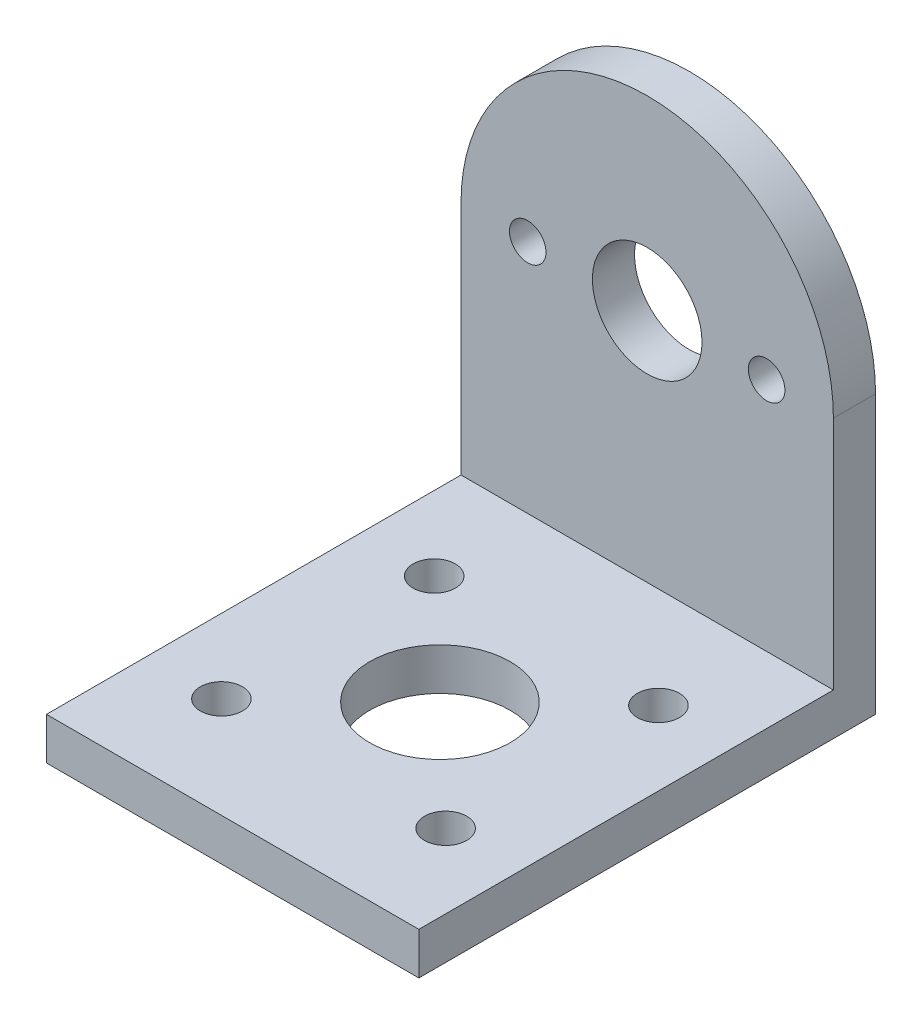
ISO-10303-21;
HEADER;
FILE_DESCRIPTION(('STEP AP214'),'2;1');
FILE_NAME('part.step','',(''),(''),'','','');
FILE_SCHEMA(('AUTOMOTIVE_DESIGN { 1 0 10303 214 1 1 1 1 }'));
ENDSEC;
DATA;
#1=APPLICATION_CONTEXT('core data for automotive mechanical design processes');
#2=APPLICATION_PROTOCOL_DEFINITION('international standard','automotive_design',2000,#1);
#3=PRODUCT_CONTEXT('',#1,'mechanical');
#4=PRODUCT('Part','Part','',(#3));
#5=PRODUCT_RELATED_PRODUCT_CATEGORY('part','',(#4));
#6=PRODUCT_DEFINITION_FORMATION('','',#4);
#7=PRODUCT_DEFINITION_CONTEXT('part definition',#1,'design');
#8=PRODUCT_DEFINITION('design','',#6,#7);
#9=PRODUCT_DEFINITION_SHAPE('','',#8);
#10=(LENGTH_UNIT() NAMED_UNIT(*) SI_UNIT(.MILLI.,.METRE.));
#11=(NAMED_UNIT(*) PLANE_ANGLE_UNIT() SI_UNIT($,.RADIAN.));
#12=(NAMED_UNIT(*) SI_UNIT($,.STERADIAN.) SOLID_ANGLE_UNIT());
#13=UNCERTAINTY_MEASURE_WITH_UNIT(LENGTH_MEASURE(1.E-05),#10,'distance_accuracy_value','');
#14=(GEOMETRIC_REPRESENTATION_CONTEXT(3) GLOBAL_UNCERTAINTY_ASSIGNED_CONTEXT((#13)) GLOBAL_UNIT_ASSIGNED_CONTEXT((#10,
#11,#12)) REPRESENTATION_CONTEXT('',''));
#15=CARTESIAN_POINT('',(0.,0.,0.));
#16=DIRECTION('',(0.,0.,1.));
#17=DIRECTION('',(1.,0.,0.));
#18=AXIS2_PLACEMENT_3D('',#15,#16,#17);
#19=CARTESIAN_POINT('',(0.,3.25,3.));
#20=DIRECTION('',(0.,0.,-1.));
#21=DIRECTION('',(-1.,0.,0.));
#22=AXIS2_PLACEMENT_3D('',#19,#20,#21);
#23=CYLINDRICAL_SURFACE('',#22,13.25);
#24=CARTESIAN_POINT('',(0.,3.25,0.));
#25=DIRECTION('',(0.,0.,1.));
#26=DIRECTION('',(1.,0.,0.));
#27=AXIS2_PLACEMENT_3D('',#24,#25,#26);
#28=CIRCLE('',#27,13.25);
#29=CARTESIAN_POINT('',(13.25,3.25,0.));
#30=VERTEX_POINT('',#29);
#31=CARTESIAN_POINT('',(-13.25,3.25,0.));
#32=VERTEX_POINT('',#31);
#33=EDGE_CURVE('E95',#30,#32,#28,.T.);
#34=ORIENTED_EDGE('',*,*,#33,.T.);
#35=DIRECTION('',(0.,0.,-1.));
#36=VECTOR('',#35,1.);
#37=CARTESIAN_POINT('',(-13.25,3.25,3.));
#38=LINE('',#37,#36);
#39=CARTESIAN_POINT('',(-13.25,3.25,3.));
#40=VERTEX_POINT('',#39);
#41=EDGE_CURVE('E11',#40,#32,#38,.T.);
#42=ORIENTED_EDGE('',*,*,#41,.F.);
#43=CARTESIAN_POINT('',(0.,3.25,3.));
#44=DIRECTION('',(0.,0.,1.));
#45=DIRECTION('',(1.,0.,0.));
#46=AXIS2_PLACEMENT_3D('',#43,#44,#45);
#47=CIRCLE('',#46,13.25);
#48=CARTESIAN_POINT('',(13.25,3.25,3.));
#49=VERTEX_POINT('',#48);
#50=EDGE_CURVE('E97',#49,#40,#47,.T.);
#51=ORIENTED_EDGE('',*,*,#50,.F.);
#52=DIRECTION('',(0.,0.,-1.));
#53=VECTOR('',#52,1.);
#54=CARTESIAN_POINT('',(13.25,3.25,3.));
#55=LINE('',#54,#53);
#56=EDGE_CURVE('E81',#49,#30,#55,.T.);
#57=ORIENTED_EDGE('',*,*,#56,.T.);
#58=EDGE_LOOP('',(#34,#42,#51,#57));
#59=FACE_BOUND('',#58,.T.);
#60=ADVANCED_FACE('F39',(#59),#23,.T.);
#61=CARTESIAN_POINT('',(-13.25,0.,3.));
#62=DIRECTION('',(-1.,0.,0.));
#63=DIRECTION('',(0.,0.,1.));
#64=AXIS2_PLACEMENT_3D('',#61,#62,#63);
#65=PLANE('',#64);
#66=DIRECTION('',(0.,1.,0.));
#67=VECTOR('',#66,1.);
#68=CARTESIAN_POINT('',(-13.25,0.,0.));
#69=LINE('',#68,#67);
#70=CARTESIAN_POINT('',(-13.25,-16.5,0.));
#71=VERTEX_POINT('',#70);
#72=EDGE_CURVE('E101',#71,#32,#69,.T.);
#73=ORIENTED_EDGE('',*,*,#72,.F.);
#74=DIRECTION('',(0.,0.,-1.));
#75=VECTOR('',#74,1.);
#76=CARTESIAN_POINT('',(-13.25,-16.5,3.));
#77=LINE('',#76,#75);
#78=CARTESIAN_POINT('',(-13.25,-16.5,32.4999999999989));
#79=VERTEX_POINT('',#78);
#80=EDGE_CURVE('E47',#79,#71,#77,.T.);
#81=ORIENTED_EDGE('',*,*,#80,.F.);
#82=DIRECTION('',(0.,-1.,0.));
#83=VECTOR('',#82,1.);
#84=CARTESIAN_POINT('',(-13.25,-13.5,32.4999999999989));
#85=LINE('',#84,#83);
#86=CARTESIAN_POINT('',(-13.25,-13.5,32.4999999999989));
#87=VERTEX_POINT('',#86);
#88=EDGE_CURVE('E140',#87,#79,#85,.T.);
#89=ORIENTED_EDGE('',*,*,#88,.F.);
#90=DIRECTION('',(0.,0.,1.));
#91=VECTOR('',#90,1.);
#92=CARTESIAN_POINT('',(-13.25,-13.5,0.));
#93=LINE('',#92,#91);
#94=CARTESIAN_POINT('',(-13.25,-13.5,3.));
#95=VERTEX_POINT('',#94);
#96=EDGE_CURVE('E126',#95,#87,#93,.T.);
#97=ORIENTED_EDGE('',*,*,#96,.F.);
#98=DIRECTION('',(0.,1.,0.));
#99=VECTOR('',#98,1.);
#100=CARTESIAN_POINT('',(-13.25,0.,3.));
#101=LINE('',#100,#99);
#102=EDGE_CURVE('E124',#95,#40,#101,.T.);
#103=ORIENTED_EDGE('',*,*,#102,.T.);
#104=ORIENTED_EDGE('',*,*,#41,.T.);
#105=EDGE_LOOP('',(#73,#81,#89,#97,#103,#104));
#106=FACE_BOUND('',#105,.T.);
#107=ADVANCED_FACE('F122',(#106),#65,.T.);
#108=CARTESIAN_POINT('',(0.,-16.5,3.));
#109=DIRECTION('',(0.,1.,0.));
#110=DIRECTION('',(0.,0.,1.));
#111=AXIS2_PLACEMENT_3D('',#108,#109,#110);
#112=PLANE('',#111);
#113=DIRECTION('',(1.,0.,0.));
#114=VECTOR('',#113,1.);
#115=CARTESIAN_POINT('',(0.,-16.5,0.));
#116=LINE('',#115,#114);
#117=CARTESIAN_POINT('',(13.25,-16.5,0.));
#118=VERTEX_POINT('',#117);
#119=EDGE_CURVE('E90',#71,#118,#116,.T.);
#120=ORIENTED_EDGE('',*,*,#119,.T.);
#121=DIRECTION('',(0.,0.,-1.));
#122=VECTOR('',#121,1.);
#123=CARTESIAN_POINT('',(13.25,-16.5,3.));
#124=LINE('',#123,#122);
#125=CARTESIAN_POINT('',(13.25,-16.5,32.4999999999989));
#126=VERTEX_POINT('',#125);
#127=EDGE_CURVE('E85',#126,#118,#124,.T.);
#128=ORIENTED_EDGE('',*,*,#127,.F.);
#129=DIRECTION('',(1.,0.,0.));
#130=VECTOR('',#129,1.);
#131=CARTESIAN_POINT('',(0.,-16.5,32.4999999999989));
#132=LINE('',#131,#130);
#133=EDGE_CURVE('E118',#79,#126,#132,.T.);
#134=ORIENTED_EDGE('',*,*,#133,.F.);
#135=ORIENTED_EDGE('',*,*,#80,.T.);
#136=EDGE_LOOP('',(#120,#128,#134,#135));
#137=FACE_BOUND('',#136,.T.);
#138=CARTESIAN_POINT('',(7.97733578583133,-16.5,10.1786446073314));
#139=DIRECTION('',(0.,-1.,0.));
#140=DIRECTION('',(0.,0.,-1.));
#141=AXIS2_PLACEMENT_3D('',#138,#139,#140);
#142=CIRCLE('',#141,1.5);
#143=CARTESIAN_POINT('',(7.97733578583133,-16.5,8.67864460733137));
#144=VERTEX_POINT('',#143);
#145=EDGE_CURVE('E233',#144,#144,#142,.T.);
#146=ORIENTED_EDGE('',*,*,#145,.F.);
#147=EDGE_LOOP('',(#146));
#148=FACE_BOUND('',#147,.T.);
#149=CARTESIAN_POINT('',(7.97733578583133,-16.5,25.3213553926675));
#150=DIRECTION('',(0.,-1.,0.));
#151=DIRECTION('',(0.,0.,-1.));
#152=AXIS2_PLACEMENT_3D('',#149,#150,#151);
#153=CIRCLE('',#152,1.5);
#154=CARTESIAN_POINT('',(7.97733578583133,-16.5,23.8213553926675));
#155=VERTEX_POINT('',#154);
#156=EDGE_CURVE('E236',#155,#155,#153,.T.);
#157=ORIENTED_EDGE('',*,*,#156,.F.);
#158=EDGE_LOOP('',(#157));
#159=FACE_BOUND('',#158,.T.);
#160=CARTESIAN_POINT('',(0.,-16.5,17.7499999999994));
#161=DIRECTION('',(0.,-1.,0.));
#162=DIRECTION('',(0.,0.,-1.));
#163=AXIS2_PLACEMENT_3D('',#160,#161,#162);
#164=CIRCLE('',#163,5.);
#165=CARTESIAN_POINT('',(0.,-16.5,12.7499999999994));
#166=VERTEX_POINT('',#165);
#167=EDGE_CURVE('E239',#166,#166,#164,.T.);
#168=ORIENTED_EDGE('',*,*,#167,.F.);
#169=EDGE_LOOP('',(#168));
#170=FACE_BOUND('',#169,.T.);
#171=CARTESIAN_POINT('',(-7.97733578583133,-16.5,25.3213553926675));
#172=DIRECTION('',(0.,-1.,0.));
#173=DIRECTION('',(0.,0.,-1.));
#174=AXIS2_PLACEMENT_3D('',#171,#172,#173);
#175=CIRCLE('',#174,1.5);
#176=CARTESIAN_POINT('',(-7.97733578583133,-16.5,23.8213553926675));
#177=VERTEX_POINT('',#176);
#178=EDGE_CURVE('E242',#177,#177,#175,.T.);
#179=ORIENTED_EDGE('',*,*,#178,.F.);
#180=EDGE_LOOP('',(#179));
#181=FACE_BOUND('',#180,.T.);
#182=CARTESIAN_POINT('',(-7.97733578583133,-16.5,10.1786446073314));
#183=DIRECTION('',(0.,-1.,0.));
#184=DIRECTION('',(0.,0.,-1.));
#185=AXIS2_PLACEMENT_3D('',#182,#183,#184);
#186=CIRCLE('',#185,1.5);
#187=CARTESIAN_POINT('',(-7.97733578583133,-16.5,8.67864460733137));
#188=VERTEX_POINT('',#187);
#189=EDGE_CURVE('E246',#188,#188,#186,.T.);
#190=ORIENTED_EDGE('',*,*,#189,.F.);
#191=EDGE_LOOP('',(#190));
#192=FACE_BOUND('',#191,.T.);
#193=ADVANCED_FACE('F114',(#137,#148,#159,#170,#181,#192),#112,.F.);
#194=CARTESIAN_POINT('',(0.,3.25,3.));
#195=DIRECTION('',(0.,0.,-1.));
#196=DIRECTION('',(-1.,0.,0.));
#197=AXIS2_PLACEMENT_3D('',#194,#195,#196);
#198=CYLINDRICAL_SURFACE('',#197,3.9);
#199=CARTESIAN_POINT('',(0.,3.25,3.));
#200=DIRECTION('',(0.,0.,1.));
#201=DIRECTION('',(1.,0.,0.));
#202=AXIS2_PLACEMENT_3D('',#199,#200,#201);
#203=CIRCLE('',#202,3.9);
#204=CARTESIAN_POINT('',(3.9,3.25,3.));
#205=VERTEX_POINT('',#204);
#206=EDGE_CURVE('E130',#205,#205,#203,.T.);
#207=ORIENTED_EDGE('',*,*,#206,.T.);
#208=EDGE_LOOP('',(#207));
#209=FACE_BOUND('',#208,.T.);
#210=CARTESIAN_POINT('',(0.,3.25,0.));
#211=DIRECTION('',(0.,0.,1.));
#212=DIRECTION('',(1.,0.,0.));
#213=AXIS2_PLACEMENT_3D('',#210,#211,#212);
#214=CIRCLE('',#213,3.9);
#215=CARTESIAN_POINT('',(3.9,3.25,0.));
#216=VERTEX_POINT('',#215);
#217=EDGE_CURVE('E102',#216,#216,#214,.T.);
#218=ORIENTED_EDGE('',*,*,#217,.F.);
#219=EDGE_LOOP('',(#218));
#220=FACE_BOUND('',#219,.T.);
#221=ADVANCED_FACE('F148',(#209,#220),#198,.F.);
#222=CARTESIAN_POINT('',(-8.5,3.25,3.));
#223=DIRECTION('',(0.,0.,-1.));
#224=DIRECTION('',(-1.,0.,0.));
#225=AXIS2_PLACEMENT_3D('',#222,#223,#224);
#226=CYLINDRICAL_SURFACE('',#225,1.3);
#227=CARTESIAN_POINT('',(-8.5,3.25,3.));
#228=DIRECTION('',(0.,0.,1.));
#229=DIRECTION('',(1.,0.,0.));
#230=AXIS2_PLACEMENT_3D('',#227,#228,#229);
#231=CIRCLE('',#230,1.3);
#232=CARTESIAN_POINT('',(-7.2,3.25,3.));
#233=VERTEX_POINT('',#232);
#234=EDGE_CURVE('E133',#233,#233,#231,.T.);
#235=ORIENTED_EDGE('',*,*,#234,.T.);
#236=EDGE_LOOP('',(#235));
#237=FACE_BOUND('',#236,.T.);
#238=CARTESIAN_POINT('',(-8.5,3.25,0.));
#239=DIRECTION('',(0.,0.,1.));
#240=DIRECTION('',(1.,0.,0.));
#241=AXIS2_PLACEMENT_3D('',#238,#239,#240);
#242=CIRCLE('',#241,1.3);
#243=CARTESIAN_POINT('',(-7.2,3.25,0.));
#244=VERTEX_POINT('',#243);
#245=EDGE_CURVE('E106',#244,#244,#242,.T.);
#246=ORIENTED_EDGE('',*,*,#245,.F.);
#247=EDGE_LOOP('',(#246));
#248=FACE_BOUND('',#247,.T.);
#249=ADVANCED_FACE('F146',(#237,#248),#226,.F.);
#250=CARTESIAN_POINT('',(8.5,3.25,3.));
#251=DIRECTION('',(0.,0.,-1.));
#252=DIRECTION('',(-1.,0.,0.));
#253=AXIS2_PLACEMENT_3D('',#250,#251,#252);
#254=CYLINDRICAL_SURFACE('',#253,1.3);
#255=CARTESIAN_POINT('',(8.5,3.25,3.));
#256=DIRECTION('',(0.,0.,1.));
#257=DIRECTION('',(1.,0.,0.));
#258=AXIS2_PLACEMENT_3D('',#255,#256,#257);
#259=CIRCLE('',#258,1.3);
#260=CARTESIAN_POINT('',(9.8,3.25,3.));
#261=VERTEX_POINT('',#260);
#262=EDGE_CURVE('E89',#261,#261,#259,.T.);
#263=ORIENTED_EDGE('',*,*,#262,.T.);
#264=EDGE_LOOP('',(#263));
#265=FACE_BOUND('',#264,.T.);
#266=CARTESIAN_POINT('',(8.5,3.25,0.));
#267=DIRECTION('',(0.,0.,1.));
#268=DIRECTION('',(1.,0.,0.));
#269=AXIS2_PLACEMENT_3D('',#266,#267,#268);
#270=CIRCLE('',#269,1.3);
#271=CARTESIAN_POINT('',(9.8,3.25,0.));
#272=VERTEX_POINT('',#271);
#273=EDGE_CURVE('E138',#272,#272,#270,.T.);
#274=ORIENTED_EDGE('',*,*,#273,.F.);
#275=EDGE_LOOP('',(#274));
#276=FACE_BOUND('',#275,.T.);
#277=ADVANCED_FACE('F41',(#265,#276),#254,.F.);
#278=CARTESIAN_POINT('',(13.25,0.,3.));
#279=DIRECTION('',(-1.,0.,0.));
#280=DIRECTION('',(0.,0.,1.));
#281=AXIS2_PLACEMENT_3D('',#278,#279,#280);
#282=PLANE('',#281);
#283=DIRECTION('',(0.,1.,0.));
#284=VECTOR('',#283,1.);
#285=CARTESIAN_POINT('',(13.25,0.,0.));
#286=LINE('',#285,#284);
#287=EDGE_CURVE('E78',#118,#30,#286,.T.);
#288=ORIENTED_EDGE('',*,*,#287,.T.);
#289=ORIENTED_EDGE('',*,*,#56,.F.);
#290=DIRECTION('',(0.,1.,0.));
#291=VECTOR('',#290,1.);
#292=CARTESIAN_POINT('',(13.25,0.,3.));
#293=LINE('',#292,#291);
#294=CARTESIAN_POINT('',(13.25,-13.5,3.));
#295=VERTEX_POINT('',#294);
#296=EDGE_CURVE('E59',#295,#49,#293,.T.);
#297=ORIENTED_EDGE('',*,*,#296,.F.);
#298=DIRECTION('',(0.,0.,1.));
#299=VECTOR('',#298,1.);
#300=CARTESIAN_POINT('',(13.25,-13.5,0.));
#301=LINE('',#300,#299);
#302=CARTESIAN_POINT('',(13.25,-13.5,32.4999999999989));
#303=VERTEX_POINT('',#302);
#304=EDGE_CURVE('E223',#295,#303,#301,.T.);
#305=ORIENTED_EDGE('',*,*,#304,.T.);
#306=DIRECTION('',(0.,-1.,0.));
#307=VECTOR('',#306,1.);
#308=CARTESIAN_POINT('',(13.25,-13.5,32.4999999999989));
#309=LINE('',#308,#307);
#310=EDGE_CURVE('E227',#303,#126,#309,.T.);
#311=ORIENTED_EDGE('',*,*,#310,.T.);
#312=ORIENTED_EDGE('',*,*,#127,.T.);
#313=EDGE_LOOP('',(#288,#289,#297,#305,#311,#312));
#314=FACE_BOUND('',#313,.T.);
#315=ADVANCED_FACE('F80',(#314),#282,.F.);
#316=CARTESIAN_POINT('',(0.,0.,3.));
#317=DIRECTION('',(0.,0.,1.));
#318=DIRECTION('',(1.,0.,0.));
#319=AXIS2_PLACEMENT_3D('',#316,#317,#318);
#320=PLANE('',#319);
#321=DIRECTION('',(-1.,0.,0.));
#322=VECTOR('',#321,1.);
#323=CARTESIAN_POINT('',(0.,-13.5,3.));
#324=LINE('',#323,#322);
#325=EDGE_CURVE('E54',#295,#95,#324,.T.);
#326=ORIENTED_EDGE('',*,*,#325,.F.);
#327=ORIENTED_EDGE('',*,*,#296,.T.);
#328=ORIENTED_EDGE('',*,*,#50,.T.);
#329=ORIENTED_EDGE('',*,*,#102,.F.);
#330=EDGE_LOOP('',(#326,#327,#328,#329));
#331=FACE_BOUND('',#330,.T.);
#332=ORIENTED_EDGE('',*,*,#262,.F.);
#333=EDGE_LOOP('',(#332));
#334=FACE_BOUND('',#333,.T.);
#335=ORIENTED_EDGE('',*,*,#234,.F.);
#336=EDGE_LOOP('',(#335));
#337=FACE_BOUND('',#336,.T.);
#338=ORIENTED_EDGE('',*,*,#206,.F.);
#339=EDGE_LOOP('',(#338));
#340=FACE_BOUND('',#339,.T.);
#341=ADVANCED_FACE('F128',(#331,#334,#337,#340),#320,.T.);
#342=CARTESIAN_POINT('',(0.,0.,0.));
#343=DIRECTION('',(0.,0.,1.));
#344=DIRECTION('',(1.,0.,0.));
#345=AXIS2_PLACEMENT_3D('',#342,#343,#344);
#346=PLANE('',#345);
#347=ORIENTED_EDGE('',*,*,#273,.T.);
#348=EDGE_LOOP('',(#347));
#349=FACE_BOUND('',#348,.T.);
#350=ORIENTED_EDGE('',*,*,#245,.T.);
#351=EDGE_LOOP('',(#350));
#352=FACE_BOUND('',#351,.T.);
#353=ORIENTED_EDGE('',*,*,#217,.T.);
#354=EDGE_LOOP('',(#353));
#355=FACE_BOUND('',#354,.T.);
#356=ORIENTED_EDGE('',*,*,#33,.F.);
#357=ORIENTED_EDGE('',*,*,#287,.F.);
#358=ORIENTED_EDGE('',*,*,#119,.F.);
#359=ORIENTED_EDGE('',*,*,#72,.T.);
#360=EDGE_LOOP('',(#356,#357,#358,#359));
#361=FACE_BOUND('',#360,.T.);
#362=ADVANCED_FACE('F99',(#349,#352,#355,#361),#346,.F.);
#363=CARTESIAN_POINT('',(0.,-13.5,32.4999999999989));
#364=DIRECTION('',(0.,0.,-1.));
#365=DIRECTION('',(-1.,0.,0.));
#366=AXIS2_PLACEMENT_3D('',#363,#364,#365);
#367=PLANE('',#366);
#368=ORIENTED_EDGE('',*,*,#133,.T.);
#369=ORIENTED_EDGE('',*,*,#310,.F.);
#370=DIRECTION('',(1.,0.,0.));
#371=VECTOR('',#370,1.);
#372=CARTESIAN_POINT('',(0.,-13.5,32.4999999999989));
#373=LINE('',#372,#371);
#374=EDGE_CURVE('E264',#87,#303,#373,.T.);
#375=ORIENTED_EDGE('',*,*,#374,.F.);
#376=ORIENTED_EDGE('',*,*,#88,.T.);
#377=EDGE_LOOP('',(#368,#369,#375,#376));
#378=FACE_BOUND('',#377,.T.);
#379=ADVANCED_FACE('F171',(#378),#367,.F.);
#380=CARTESIAN_POINT('',(-7.97733578583133,-13.5,25.3213553926675));
#381=DIRECTION('',(0.,-1.,0.));
#382=DIRECTION('',(0.,0.,-1.));
#383=AXIS2_PLACEMENT_3D('',#380,#381,#382);
#384=CYLINDRICAL_SURFACE('',#383,1.5);
#385=CARTESIAN_POINT('',(-7.97733578583133,-13.5,25.3213553926675));
#386=DIRECTION('',(0.,-1.,0.));
#387=DIRECTION('',(0.,0.,-1.));
#388=AXIS2_PLACEMENT_3D('',#385,#386,#387);
#389=CIRCLE('',#388,1.5);
#390=CARTESIAN_POINT('',(-7.97733578583133,-13.5,23.8213553926675));
#391=VERTEX_POINT('',#390);
#392=EDGE_CURVE('E218',#391,#391,#389,.T.);
#393=ORIENTED_EDGE('',*,*,#392,.F.);
#394=EDGE_LOOP('',(#393));
#395=FACE_BOUND('',#394,.T.);
#396=ORIENTED_EDGE('',*,*,#178,.T.);
#397=EDGE_LOOP('',(#396));
#398=FACE_BOUND('',#397,.T.);
#399=ADVANCED_FACE('F187',(#395,#398),#384,.F.);
#400=CARTESIAN_POINT('',(0.,-13.5,17.7499999999994));
#401=DIRECTION('',(0.,-1.,0.));
#402=DIRECTION('',(0.,0.,-1.));
#403=AXIS2_PLACEMENT_3D('',#400,#401,#402);
#404=CYLINDRICAL_SURFACE('',#403,5.);
#405=CARTESIAN_POINT('',(0.,-13.5,17.7499999999994));
#406=DIRECTION('',(0.,-1.,0.));
#407=DIRECTION('',(0.,0.,-1.));
#408=AXIS2_PLACEMENT_3D('',#405,#406,#407);
#409=CIRCLE('',#408,5.);
#410=CARTESIAN_POINT('',(0.,-13.5,12.7499999999994));
#411=VERTEX_POINT('',#410);
#412=EDGE_CURVE('E214',#411,#411,#409,.T.);
#413=ORIENTED_EDGE('',*,*,#412,.F.);
#414=EDGE_LOOP('',(#413));
#415=FACE_BOUND('',#414,.T.);
#416=ORIENTED_EDGE('',*,*,#167,.T.);
#417=EDGE_LOOP('',(#416));
#418=FACE_BOUND('',#417,.T.);
#419=ADVANCED_FACE('F183',(#415,#418),#404,.F.);
#420=CARTESIAN_POINT('',(7.97733578583133,-13.5,25.3213553926675));
#421=DIRECTION('',(0.,-1.,0.));
#422=DIRECTION('',(0.,0.,-1.));
#423=AXIS2_PLACEMENT_3D('',#420,#421,#422);
#424=CYLINDRICAL_SURFACE('',#423,1.5);
#425=CARTESIAN_POINT('',(7.97733578583133,-13.5,25.3213553926675));
#426=DIRECTION('',(0.,-1.,0.));
#427=DIRECTION('',(0.,0.,-1.));
#428=AXIS2_PLACEMENT_3D('',#425,#426,#427);
#429=CIRCLE('',#428,1.5);
#430=CARTESIAN_POINT('',(7.97733578583133,-13.5,23.8213553926675));
#431=VERTEX_POINT('',#430);
#432=EDGE_CURVE('E210',#431,#431,#429,.T.);
#433=ORIENTED_EDGE('',*,*,#432,.F.);
#434=EDGE_LOOP('',(#433));
#435=FACE_BOUND('',#434,.T.);
#436=ORIENTED_EDGE('',*,*,#156,.T.);
#437=EDGE_LOOP('',(#436));
#438=FACE_BOUND('',#437,.T.);
#439=ADVANCED_FACE('F179',(#435,#438),#424,.F.);
#440=CARTESIAN_POINT('',(7.97733578583133,-13.5,10.1786446073314));
#441=DIRECTION('',(0.,-1.,0.));
#442=DIRECTION('',(0.,0.,-1.));
#443=AXIS2_PLACEMENT_3D('',#440,#441,#442);
#444=CYLINDRICAL_SURFACE('',#443,1.5);
#445=CARTESIAN_POINT('',(7.97733578583133,-13.5,10.1786446073314));
#446=DIRECTION('',(0.,-1.,0.));
#447=DIRECTION('',(0.,0.,-1.));
#448=AXIS2_PLACEMENT_3D('',#445,#446,#447);
#449=CIRCLE('',#448,1.5);
#450=CARTESIAN_POINT('',(7.97733578583133,-13.5,8.67864460733137));
#451=VERTEX_POINT('',#450);
#452=EDGE_CURVE('E206',#451,#451,#449,.T.);
#453=ORIENTED_EDGE('',*,*,#452,.F.);
#454=EDGE_LOOP('',(#453));
#455=FACE_BOUND('',#454,.T.);
#456=ORIENTED_EDGE('',*,*,#145,.T.);
#457=EDGE_LOOP('',(#456));
#458=FACE_BOUND('',#457,.T.);
#459=ADVANCED_FACE('F175',(#455,#458),#444,.F.);
#460=CARTESIAN_POINT('',(-7.97733578583133,-13.5,10.1786446073314));
#461=DIRECTION('',(0.,-1.,0.));
#462=DIRECTION('',(0.,0.,-1.));
#463=AXIS2_PLACEMENT_3D('',#460,#461,#462);
#464=CYLINDRICAL_SURFACE('',#463,1.5);
#465=CARTESIAN_POINT('',(-7.97733578583133,-13.5,10.1786446073314));
#466=DIRECTION('',(0.,-1.,0.));
#467=DIRECTION('',(0.,0.,-1.));
#468=AXIS2_PLACEMENT_3D('',#465,#466,#467);
#469=CIRCLE('',#468,1.5);
#470=CARTESIAN_POINT('',(-7.97733578583133,-13.5,8.67864460733137));
#471=VERTEX_POINT('',#470);
#472=EDGE_CURVE('E226',#471,#471,#469,.T.);
#473=ORIENTED_EDGE('',*,*,#472,.F.);
#474=EDGE_LOOP('',(#473));
#475=FACE_BOUND('',#474,.T.);
#476=ORIENTED_EDGE('',*,*,#189,.T.);
#477=EDGE_LOOP('',(#476));
#478=FACE_BOUND('',#477,.T.);
#479=ADVANCED_FACE('F178',(#475,#478),#464,.F.);
#480=CARTESIAN_POINT('',(0.,-13.5,0.));
#481=DIRECTION('',(0.,-1.,0.));
#482=DIRECTION('',(0.,0.,-1.));
#483=AXIS2_PLACEMENT_3D('',#480,#481,#482);
#484=PLANE('',#483);
#485=ORIENTED_EDGE('',*,*,#452,.T.);
#486=EDGE_LOOP('',(#485));
#487=FACE_BOUND('',#486,.T.);
#488=ORIENTED_EDGE('',*,*,#432,.T.);
#489=EDGE_LOOP('',(#488));
#490=FACE_BOUND('',#489,.T.);
#491=ORIENTED_EDGE('',*,*,#412,.T.);
#492=EDGE_LOOP('',(#491));
#493=FACE_BOUND('',#492,.T.);
#494=ORIENTED_EDGE('',*,*,#392,.T.);
#495=EDGE_LOOP('',(#494));
#496=FACE_BOUND('',#495,.T.);
#497=ORIENTED_EDGE('',*,*,#304,.F.);
#498=ORIENTED_EDGE('',*,*,#325,.T.);
#499=ORIENTED_EDGE('',*,*,#96,.T.);
#500=ORIENTED_EDGE('',*,*,#374,.T.);
#501=EDGE_LOOP('',(#497,#498,#499,#500));
#502=FACE_BOUND('',#501,.T.);
#503=ORIENTED_EDGE('',*,*,#472,.T.);
#504=EDGE_LOOP('',(#503));
#505=FACE_BOUND('',#504,.T.);
#506=ADVANCED_FACE('F197',(#487,#490,#493,#496,#502,#505),#484,.F.);
#507=CLOSED_SHELL('',(#60,#107,#193,#221,#249,#277,#315,#341,#362,#379,#399,#419,#439,#459,#479,#506));
#508=MANIFOLD_SOLID_BREP('B2',#507);
#509=ADVANCED_BREP_SHAPE_REPRESENTATION('',(#18,#508),#14);
#510=SHAPE_DEFINITION_REPRESENTATION(#9,#509);
ENDSEC;
END-ISO-10303-21;
